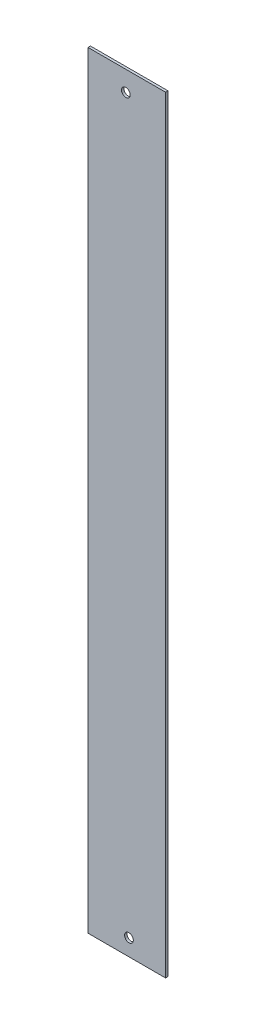
ISO-10303-21;
HEADER;
FILE_DESCRIPTION(('STEP AP214'),'2;1');
FILE_NAME('part.step','',(''),(''),'','','');
FILE_SCHEMA(('AUTOMOTIVE_DESIGN { 1 0 10303 214 1 1 1 1 }'));
ENDSEC;
DATA;
#1=APPLICATION_CONTEXT('core data for automotive mechanical design processes');
#2=APPLICATION_PROTOCOL_DEFINITION('international standard','automotive_design',2000,#1);
#3=PRODUCT_CONTEXT('',#1,'mechanical');
#4=PRODUCT('Part','Part','',(#3));
#5=PRODUCT_RELATED_PRODUCT_CATEGORY('part','',(#4));
#6=PRODUCT_DEFINITION_FORMATION('','',#4);
#7=PRODUCT_DEFINITION_CONTEXT('part definition',#1,'design');
#8=PRODUCT_DEFINITION('design','',#6,#7);
#9=PRODUCT_DEFINITION_SHAPE('','',#8);
#10=(LENGTH_UNIT() NAMED_UNIT(*) SI_UNIT(.MILLI.,.METRE.));
#11=(NAMED_UNIT(*) PLANE_ANGLE_UNIT() SI_UNIT($,.RADIAN.));
#12=(NAMED_UNIT(*) SI_UNIT($,.STERADIAN.) SOLID_ANGLE_UNIT());
#13=UNCERTAINTY_MEASURE_WITH_UNIT(LENGTH_MEASURE(1.E-05),#10,'distance_accuracy_value','');
#14=(GEOMETRIC_REPRESENTATION_CONTEXT(3) GLOBAL_UNCERTAINTY_ASSIGNED_CONTEXT((#13)) GLOBAL_UNIT_ASSIGNED_CONTEXT((#10,
#11,#12)) REPRESENTATION_CONTEXT('',''));
#15=CARTESIAN_POINT('',(0.,0.,0.));
#16=DIRECTION('',(0.,0.,1.));
#17=DIRECTION('',(1.,0.,0.));
#18=AXIS2_PLACEMENT_3D('',#15,#16,#17);
#19=CARTESIAN_POINT('',(0.,0.,-1.4));
#20=DIRECTION('',(-1.,0.,0.));
#21=DIRECTION('',(0.,0.,1.));
#22=AXIS2_PLACEMENT_3D('',#19,#20,#21);
#23=PLANE('',#22);
#24=DIRECTION('',(0.,-1.,0.));
#25=VECTOR('',#24,1.);
#26=CARTESIAN_POINT('',(0.,0.,0.));
#27=LINE('',#26,#25);
#28=CARTESIAN_POINT('',(0.,440.,0.));
#29=VERTEX_POINT('',#28);
#30=CARTESIAN_POINT('',(0.,0.,0.));
#31=VERTEX_POINT('',#30);
#32=EDGE_CURVE('E102',#29,#31,#27,.T.);
#33=ORIENTED_EDGE('',*,*,#32,.F.);
#34=DIRECTION('',(0.,0.,1.));
#35=VECTOR('',#34,1.);
#36=CARTESIAN_POINT('',(0.,440.,-1.4));
#37=LINE('',#36,#35);
#38=CARTESIAN_POINT('',(0.,440.,-1.4));
#39=VERTEX_POINT('',#38);
#40=EDGE_CURVE('E11',#39,#29,#37,.T.);
#41=ORIENTED_EDGE('',*,*,#40,.F.);
#42=DIRECTION('',(0.,-1.,0.));
#43=VECTOR('',#42,1.);
#44=CARTESIAN_POINT('',(0.,0.,-1.4));
#45=LINE('',#44,#43);
#46=CARTESIAN_POINT('',(0.,0.,-1.4));
#47=VERTEX_POINT('',#46);
#48=EDGE_CURVE('E95',#39,#47,#45,.T.);
#49=ORIENTED_EDGE('',*,*,#48,.T.);
#50=DIRECTION('',(0.,0.,1.));
#51=VECTOR('',#50,1.);
#52=CARTESIAN_POINT('',(0.,0.,-1.4));
#53=LINE('',#52,#51);
#54=EDGE_CURVE('E40',#47,#31,#53,.T.);
#55=ORIENTED_EDGE('',*,*,#54,.T.);
#56=EDGE_LOOP('',(#33,#41,#49,#55));
#57=FACE_BOUND('',#56,.T.);
#58=ADVANCED_FACE('F37',(#57),#23,.T.);
#59=CARTESIAN_POINT('',(0.,440.,-1.4));
#60=DIRECTION('',(0.,1.,0.));
#61=DIRECTION('',(0.,0.,1.));
#62=AXIS2_PLACEMENT_3D('',#59,#60,#61);
#63=PLANE('',#62);
#64=DIRECTION('',(-1.,0.,0.));
#65=VECTOR('',#64,1.);
#66=CARTESIAN_POINT('',(0.,440.,0.));
#67=LINE('',#66,#65);
#68=CARTESIAN_POINT('',(44.5,440.,0.));
#69=VERTEX_POINT('',#68);
#70=EDGE_CURVE('E97',#69,#29,#67,.T.);
#71=ORIENTED_EDGE('',*,*,#70,.F.);
#72=DIRECTION('',(0.,0.,1.));
#73=VECTOR('',#72,1.);
#74=CARTESIAN_POINT('',(44.5,440.,-1.4));
#75=LINE('',#74,#73);
#76=CARTESIAN_POINT('',(44.5,440.,-1.4));
#77=VERTEX_POINT('',#76);
#78=EDGE_CURVE('E46',#77,#69,#75,.T.);
#79=ORIENTED_EDGE('',*,*,#78,.F.);
#80=DIRECTION('',(-1.,0.,0.));
#81=VECTOR('',#80,1.);
#82=CARTESIAN_POINT('',(0.,440.,-1.4));
#83=LINE('',#82,#81);
#84=EDGE_CURVE('E92',#77,#39,#83,.T.);
#85=ORIENTED_EDGE('',*,*,#84,.T.);
#86=ORIENTED_EDGE('',*,*,#40,.T.);
#87=EDGE_LOOP('',(#71,#79,#85,#86));
#88=FACE_BOUND('',#87,.T.);
#89=ADVANCED_FACE('F113',(#88),#63,.T.);
#90=CARTESIAN_POINT('',(44.5,0.,-1.4));
#91=DIRECTION('',(1.,0.,0.));
#92=DIRECTION('',(0.,0.,-1.));
#93=AXIS2_PLACEMENT_3D('',#90,#91,#92);
#94=PLANE('',#93);
#95=DIRECTION('',(0.,1.,0.));
#96=VECTOR('',#95,1.);
#97=CARTESIAN_POINT('',(44.5,0.,0.));
#98=LINE('',#97,#96);
#99=CARTESIAN_POINT('',(44.5,0.,0.));
#100=VERTEX_POINT('',#99);
#101=EDGE_CURVE('E87',#100,#69,#98,.T.);
#102=ORIENTED_EDGE('',*,*,#101,.F.);
#103=DIRECTION('',(0.,0.,1.));
#104=VECTOR('',#103,1.);
#105=CARTESIAN_POINT('',(44.5,0.,-1.4));
#106=LINE('',#105,#104);
#107=CARTESIAN_POINT('',(44.5,0.,-1.4));
#108=VERTEX_POINT('',#107);
#109=EDGE_CURVE('E82',#108,#100,#106,.T.);
#110=ORIENTED_EDGE('',*,*,#109,.F.);
#111=DIRECTION('',(0.,1.,0.));
#112=VECTOR('',#111,1.);
#113=CARTESIAN_POINT('',(44.5,0.,-1.4));
#114=LINE('',#113,#112);
#115=EDGE_CURVE('E85',#108,#77,#114,.T.);
#116=ORIENTED_EDGE('',*,*,#115,.T.);
#117=ORIENTED_EDGE('',*,*,#78,.T.);
#118=EDGE_LOOP('',(#102,#110,#116,#117));
#119=FACE_BOUND('',#118,.T.);
#120=ADVANCED_FACE('F84',(#119),#94,.T.);
#121=CARTESIAN_POINT('',(0.,0.,-1.4));
#122=DIRECTION('',(0.,-1.,0.));
#123=DIRECTION('',(0.,0.,-1.));
#124=AXIS2_PLACEMENT_3D('',#121,#122,#123);
#125=PLANE('',#124);
#126=DIRECTION('',(1.,0.,0.));
#127=VECTOR('',#126,1.);
#128=CARTESIAN_POINT('',(0.,0.,0.));
#129=LINE('',#128,#127);
#130=EDGE_CURVE('E105',#31,#100,#129,.T.);
#131=ORIENTED_EDGE('',*,*,#130,.F.);
#132=ORIENTED_EDGE('',*,*,#54,.F.);
#133=DIRECTION('',(1.,0.,0.));
#134=VECTOR('',#133,1.);
#135=CARTESIAN_POINT('',(0.,0.,-1.4));
#136=LINE('',#135,#134);
#137=EDGE_CURVE('E91',#47,#108,#136,.T.);
#138=ORIENTED_EDGE('',*,*,#137,.T.);
#139=ORIENTED_EDGE('',*,*,#109,.T.);
#140=EDGE_LOOP('',(#131,#132,#138,#139));
#141=FACE_BOUND('',#140,.T.);
#142=ADVANCED_FACE('F94',(#141),#125,.T.);
#143=CARTESIAN_POINT('',(0.,0.,-1.4));
#144=DIRECTION('',(0.,0.,-1.));
#145=DIRECTION('',(-1.,0.,0.));
#146=AXIS2_PLACEMENT_3D('',#143,#144,#145);
#147=PLANE('',#146);
#148=CARTESIAN_POINT('',(21.7,428.5,-1.4));
#149=DIRECTION('',(0.,0.,-1.));
#150=DIRECTION('',(-1.,0.,0.));
#151=AXIS2_PLACEMENT_3D('',#148,#149,#150);
#152=CIRCLE('',#151,2.5);
#153=CARTESIAN_POINT('',(19.2,428.5,-1.4));
#154=VERTEX_POINT('',#153);
#155=EDGE_CURVE('E146',#154,#154,#152,.F.);
#156=ORIENTED_EDGE('',*,*,#155,.T.);
#157=EDGE_LOOP('',(#156));
#158=FACE_BOUND('',#157,.T.);
#159=CARTESIAN_POINT('',(23.5,9.5,-1.4));
#160=DIRECTION('',(0.,0.,-1.));
#161=DIRECTION('',(-1.,0.,0.));
#162=AXIS2_PLACEMENT_3D('',#159,#160,#161);
#163=CIRCLE('',#162,2.5);
#164=CARTESIAN_POINT('',(21.,9.5,-1.4));
#165=VERTEX_POINT('',#164);
#166=EDGE_CURVE('E154',#165,#165,#163,.F.);
#167=ORIENTED_EDGE('',*,*,#166,.T.);
#168=EDGE_LOOP('',(#167));
#169=FACE_BOUND('',#168,.T.);
#170=ORIENTED_EDGE('',*,*,#48,.F.);
#171=ORIENTED_EDGE('',*,*,#84,.F.);
#172=ORIENTED_EDGE('',*,*,#115,.F.);
#173=ORIENTED_EDGE('',*,*,#137,.F.);
#174=EDGE_LOOP('',(#170,#171,#172,#173));
#175=FACE_BOUND('',#174,.T.);
#176=ADVANCED_FACE('F90',(#158,#169,#175),#147,.T.);
#177=CARTESIAN_POINT('',(0.,0.,0.));
#178=DIRECTION('',(0.,0.,-1.));
#179=DIRECTION('',(-1.,0.,0.));
#180=AXIS2_PLACEMENT_3D('',#177,#178,#179);
#181=PLANE('',#180);
#182=CARTESIAN_POINT('',(21.7,428.5,0.));
#183=DIRECTION('',(0.,0.,1.));
#184=DIRECTION('',(1.,0.,0.));
#185=AXIS2_PLACEMENT_3D('',#182,#183,#184);
#186=CIRCLE('',#185,2.5);
#187=CARTESIAN_POINT('',(24.2,428.5,0.));
#188=VERTEX_POINT('',#187);
#189=EDGE_CURVE('E106',#188,#188,#186,.T.);
#190=ORIENTED_EDGE('',*,*,#189,.F.);
#191=EDGE_LOOP('',(#190));
#192=FACE_BOUND('',#191,.T.);
#193=CARTESIAN_POINT('',(23.5,9.5,0.));
#194=DIRECTION('',(0.,0.,1.));
#195=DIRECTION('',(1.,0.,0.));
#196=AXIS2_PLACEMENT_3D('',#193,#194,#195);
#197=CIRCLE('',#196,2.5);
#198=CARTESIAN_POINT('',(26.,9.5,0.));
#199=VERTEX_POINT('',#198);
#200=EDGE_CURVE('E150',#199,#199,#197,.T.);
#201=ORIENTED_EDGE('',*,*,#200,.F.);
#202=EDGE_LOOP('',(#201));
#203=FACE_BOUND('',#202,.T.);
#204=ORIENTED_EDGE('',*,*,#32,.T.);
#205=ORIENTED_EDGE('',*,*,#130,.T.);
#206=ORIENTED_EDGE('',*,*,#101,.T.);
#207=ORIENTED_EDGE('',*,*,#70,.T.);
#208=EDGE_LOOP('',(#204,#205,#206,#207));
#209=FACE_BOUND('',#208,.T.);
#210=ADVANCED_FACE('F112',(#192,#203,#209),#181,.F.);
#211=CARTESIAN_POINT('',(23.5,9.5,-1.401));
#212=DIRECTION('',(0.,0.,1.));
#213=DIRECTION('',(1.,0.,0.));
#214=AXIS2_PLACEMENT_3D('',#211,#212,#213);
#215=CYLINDRICAL_SURFACE('',#214,2.5);
#216=ORIENTED_EDGE('',*,*,#166,.F.);
#217=EDGE_LOOP('',(#216));
#218=FACE_BOUND('',#217,.T.);
#219=ORIENTED_EDGE('',*,*,#200,.T.);
#220=EDGE_LOOP('',(#219));
#221=FACE_BOUND('',#220,.T.);
#222=ADVANCED_FACE('F131',(#218,#221),#215,.F.);
#223=CARTESIAN_POINT('',(21.7,428.5,-1.401));
#224=DIRECTION('',(0.,0.,1.));
#225=DIRECTION('',(1.,0.,0.));
#226=AXIS2_PLACEMENT_3D('',#223,#224,#225);
#227=CYLINDRICAL_SURFACE('',#226,2.5);
#228=ORIENTED_EDGE('',*,*,#155,.F.);
#229=EDGE_LOOP('',(#228));
#230=FACE_BOUND('',#229,.T.);
#231=ORIENTED_EDGE('',*,*,#189,.T.);
#232=EDGE_LOOP('',(#231));
#233=FACE_BOUND('',#232,.T.);
#234=ADVANCED_FACE('F138',(#230,#233),#227,.F.);
#235=CLOSED_SHELL('',(#58,#89,#120,#142,#176,#210,#222,#234));
#236=MANIFOLD_SOLID_BREP('B2',#235);
#237=ADVANCED_BREP_SHAPE_REPRESENTATION('',(#18,#236),#14);
#238=SHAPE_DEFINITION_REPRESENTATION(#9,#237);
ENDSEC;
END-ISO-10303-21;
